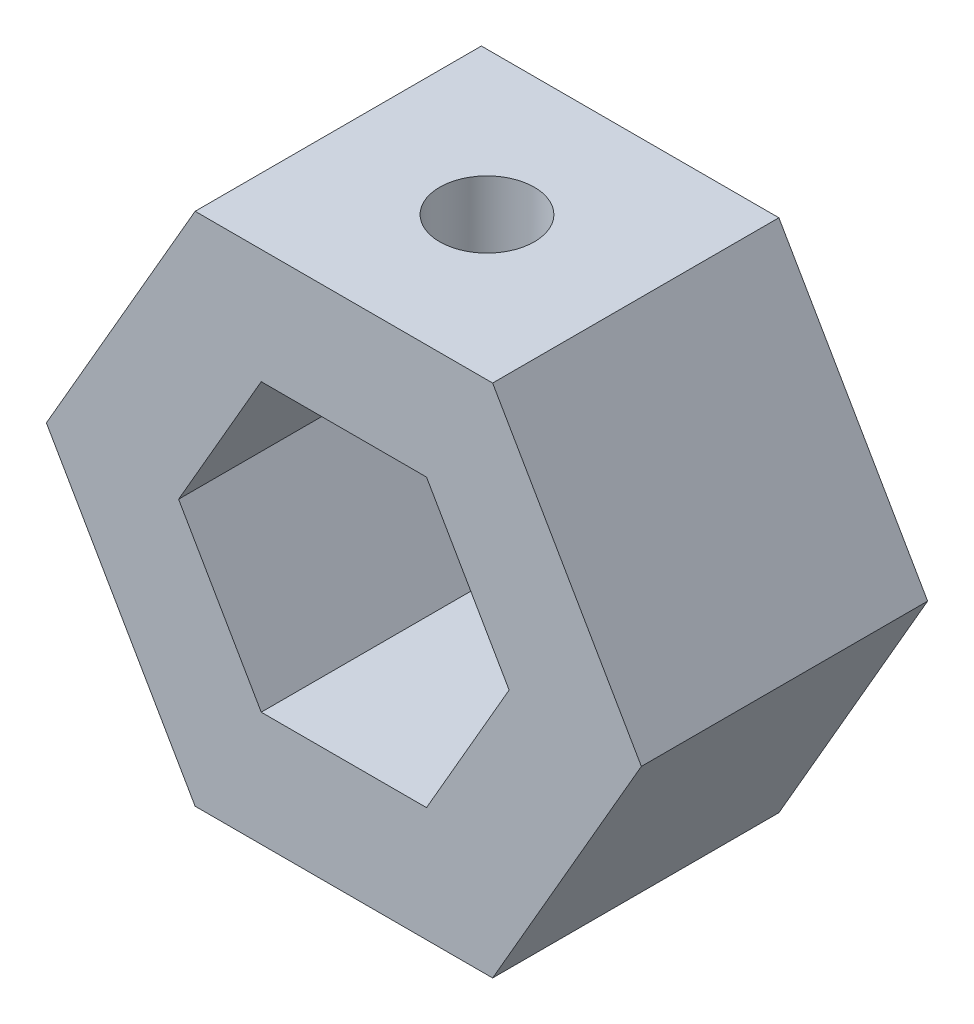
ISO-10303-21;
HEADER;
FILE_DESCRIPTION(('STEP AP214'),'2;1');
FILE_NAME('part.step','',(''),(''),'','','');
FILE_SCHEMA(('AUTOMOTIVE_DESIGN { 1 0 10303 214 1 1 1 1 }'));
ENDSEC;
DATA;
#1=APPLICATION_CONTEXT('core data for automotive mechanical design processes');
#2=APPLICATION_PROTOCOL_DEFINITION('international standard','automotive_design',2000,#1);
#3=PRODUCT_CONTEXT('',#1,'mechanical');
#4=PRODUCT('Part','Part','',(#3));
#5=PRODUCT_RELATED_PRODUCT_CATEGORY('part','',(#4));
#6=PRODUCT_DEFINITION_FORMATION('','',#4);
#7=PRODUCT_DEFINITION_CONTEXT('part definition',#1,'design');
#8=PRODUCT_DEFINITION('design','',#6,#7);
#9=PRODUCT_DEFINITION_SHAPE('','',#8);
#10=(LENGTH_UNIT() NAMED_UNIT(*) SI_UNIT(.MILLI.,.METRE.));
#11=(NAMED_UNIT(*) PLANE_ANGLE_UNIT() SI_UNIT($,.RADIAN.));
#12=(NAMED_UNIT(*) SI_UNIT($,.STERADIAN.) SOLID_ANGLE_UNIT());
#13=UNCERTAINTY_MEASURE_WITH_UNIT(LENGTH_MEASURE(1.E-05),#10,'distance_accuracy_value','');
#14=(GEOMETRIC_REPRESENTATION_CONTEXT(3) GLOBAL_UNCERTAINTY_ASSIGNED_CONTEXT((#13)) GLOBAL_UNIT_ASSIGNED_CONTEXT((#10,
#11,#12)) REPRESENTATION_CONTEXT('',''));
#15=CARTESIAN_POINT('',(0.,0.,0.));
#16=DIRECTION('',(0.,0.,1.));
#17=DIRECTION('',(1.,0.,0.));
#18=AXIS2_PLACEMENT_3D('',#15,#16,#17);
#19=CARTESIAN_POINT('',(9.89867036525614,-5.715,2.54));
#20=DIRECTION('',(-0.866025403784439,0.5,0.));
#21=DIRECTION('',(-0.5,-0.866025403784439,0.));
#22=AXIS2_PLACEMENT_3D('',#19,#20,#21);
#23=PLANE('',#22);
#24=DIRECTION('',(0.5,0.866025403784439,0.));
#25=VECTOR('',#24,1.);
#26=CARTESIAN_POINT('',(9.89867036525614,-5.715,0.));
#27=LINE('',#26,#25);
#28=CARTESIAN_POINT('',(6.59911357683742,-11.43,0.));
#29=VERTEX_POINT('',#28);
#30=CARTESIAN_POINT('',(13.1982271536748,0.,0.));
#31=VERTEX_POINT('',#30);
#32=EDGE_CURVE('E218',#29,#31,#27,.T.);
#33=ORIENTED_EDGE('',*,*,#32,.T.);
#34=DIRECTION('',(0.,0.,-1.));
#35=VECTOR('',#34,1.);
#36=CARTESIAN_POINT('',(13.1982271536748,0.,2.54));
#37=LINE('',#36,#35);
#38=CARTESIAN_POINT('',(13.1982271536748,0.,12.7));
#39=VERTEX_POINT('',#38);
#40=EDGE_CURVE('E11',#39,#31,#37,.T.);
#41=ORIENTED_EDGE('',*,*,#40,.F.);
#42=DIRECTION('',(0.5,0.866025403784439,0.));
#43=VECTOR('',#42,1.);
#44=CARTESIAN_POINT('',(6.59911357683742,-11.43,12.7));
#45=LINE('',#44,#43);
#46=CARTESIAN_POINT('',(6.59911357683742,-11.43,12.7));
#47=VERTEX_POINT('',#46);
#48=EDGE_CURVE('E193',#47,#39,#45,.T.);
#49=ORIENTED_EDGE('',*,*,#48,.F.);
#50=DIRECTION('',(0.,0.,-1.));
#51=VECTOR('',#50,1.);
#52=CARTESIAN_POINT('',(6.59911357683742,-11.43,2.54));
#53=LINE('',#52,#51);
#54=EDGE_CURVE('E231',#47,#29,#53,.T.);
#55=ORIENTED_EDGE('',*,*,#54,.T.);
#56=EDGE_LOOP('',(#33,#41,#49,#55));
#57=FACE_BOUND('',#56,.T.);
#58=ADVANCED_FACE('F47',(#57),#23,.F.);
#59=CARTESIAN_POINT('',(9.89867036525613,5.715,2.54));
#60=DIRECTION('',(-0.866025403784439,-0.5,0.));
#61=DIRECTION('',(0.5,-0.866025403784439,0.));
#62=AXIS2_PLACEMENT_3D('',#59,#60,#61);
#63=PLANE('',#62);
#64=DIRECTION('',(-0.5,0.866025403784439,0.));
#65=VECTOR('',#64,1.);
#66=CARTESIAN_POINT('',(9.89867036525613,5.715,0.));
#67=LINE('',#66,#65);
#68=CARTESIAN_POINT('',(6.59911357683742,11.43,0.));
#69=VERTEX_POINT('',#68);
#70=EDGE_CURVE('E221',#31,#69,#67,.T.);
#71=ORIENTED_EDGE('',*,*,#70,.T.);
#72=DIRECTION('',(0.,0.,-1.));
#73=VECTOR('',#72,1.);
#74=CARTESIAN_POINT('',(6.59911357683742,11.43,2.54));
#75=LINE('',#74,#73);
#76=CARTESIAN_POINT('',(6.59911357683742,11.43,12.7));
#77=VERTEX_POINT('',#76);
#78=EDGE_CURVE('E54',#77,#69,#75,.T.);
#79=ORIENTED_EDGE('',*,*,#78,.F.);
#80=DIRECTION('',(-0.5,0.866025403784439,0.));
#81=VECTOR('',#80,1.);
#82=CARTESIAN_POINT('',(13.1982271536748,0.,12.7));
#83=LINE('',#82,#81);
#84=EDGE_CURVE('E150',#39,#77,#83,.T.);
#85=ORIENTED_EDGE('',*,*,#84,.F.);
#86=ORIENTED_EDGE('',*,*,#40,.T.);
#87=EDGE_LOOP('',(#71,#79,#85,#86));
#88=FACE_BOUND('',#87,.T.);
#89=ADVANCED_FACE('F267',(#88),#63,.F.);
#90=CARTESIAN_POINT('',(0.,11.43,2.54));
#91=DIRECTION('',(0.,-1.,0.));
#92=DIRECTION('',(0.,0.,-1.));
#93=AXIS2_PLACEMENT_3D('',#90,#91,#92);
#94=PLANE('',#93);
#95=CARTESIAN_POINT('',(0.,11.43,6.35));
#96=DIRECTION('',(0.,1.,0.));
#97=DIRECTION('',(0.,0.,1.));
#98=AXIS2_PLACEMENT_3D('',#95,#96,#97);
#99=CIRCLE('',#98,2.1);
#100=CARTESIAN_POINT('',(0.,11.43,8.45));
#101=VERTEX_POINT('',#100);
#102=EDGE_CURVE('E326',#101,#101,#99,.T.);
#103=ORIENTED_EDGE('',*,*,#102,.F.);
#104=EDGE_LOOP('',(#103));
#105=FACE_BOUND('',#104,.T.);
#106=DIRECTION('',(-1.,0.,0.));
#107=VECTOR('',#106,1.);
#108=CARTESIAN_POINT('',(0.,11.43,0.));
#109=LINE('',#108,#107);
#110=CARTESIAN_POINT('',(-6.59911357683742,11.43,0.));
#111=VERTEX_POINT('',#110);
#112=EDGE_CURVE('E223',#69,#111,#109,.T.);
#113=ORIENTED_EDGE('',*,*,#112,.T.);
#114=DIRECTION('',(0.,0.,-1.));
#115=VECTOR('',#114,1.);
#116=CARTESIAN_POINT('',(-6.59911357683742,11.43,2.54));
#117=LINE('',#116,#115);
#118=CARTESIAN_POINT('',(-6.59911357683742,11.43,12.7));
#119=VERTEX_POINT('',#118);
#120=EDGE_CURVE('E240',#119,#111,#117,.T.);
#121=ORIENTED_EDGE('',*,*,#120,.F.);
#122=DIRECTION('',(-1.,0.,0.));
#123=VECTOR('',#122,1.);
#124=CARTESIAN_POINT('',(6.59911357683742,11.43,12.7));
#125=LINE('',#124,#123);
#126=EDGE_CURVE('E181',#77,#119,#125,.T.);
#127=ORIENTED_EDGE('',*,*,#126,.F.);
#128=ORIENTED_EDGE('',*,*,#78,.T.);
#129=EDGE_LOOP('',(#113,#121,#127,#128));
#130=FACE_BOUND('',#129,.T.);
#131=ADVANCED_FACE('F246',(#105,#130),#94,.F.);
#132=CARTESIAN_POINT('',(-9.89867036525613,5.715,2.54));
#133=DIRECTION('',(0.866025403784439,-0.5,0.));
#134=DIRECTION('',(0.5,0.866025403784439,0.));
#135=AXIS2_PLACEMENT_3D('',#132,#133,#134);
#136=PLANE('',#135);
#137=DIRECTION('',(-0.5,-0.866025403784439,0.));
#138=VECTOR('',#137,1.);
#139=CARTESIAN_POINT('',(-9.89867036525613,5.715,0.));
#140=LINE('',#139,#138);
#141=CARTESIAN_POINT('',(-13.1982271536748,0.,0.));
#142=VERTEX_POINT('',#141);
#143=EDGE_CURVE('E225',#111,#142,#140,.T.);
#144=ORIENTED_EDGE('',*,*,#143,.T.);
#145=DIRECTION('',(0.,0.,-1.));
#146=VECTOR('',#145,1.);
#147=CARTESIAN_POINT('',(-13.1982271536748,0.,2.54));
#148=LINE('',#147,#146);
#149=CARTESIAN_POINT('',(-13.1982271536748,0.,12.7));
#150=VERTEX_POINT('',#149);
#151=EDGE_CURVE('E237',#150,#142,#148,.T.);
#152=ORIENTED_EDGE('',*,*,#151,.F.);
#153=DIRECTION('',(-0.5,-0.866025403784439,0.));
#154=VECTOR('',#153,1.);
#155=CARTESIAN_POINT('',(-6.59911357683742,11.43,12.7));
#156=LINE('',#155,#154);
#157=EDGE_CURVE('E184',#119,#150,#156,.T.);
#158=ORIENTED_EDGE('',*,*,#157,.F.);
#159=ORIENTED_EDGE('',*,*,#120,.T.);
#160=EDGE_LOOP('',(#144,#152,#158,#159));
#161=FACE_BOUND('',#160,.T.);
#162=ADVANCED_FACE('F256',(#161),#136,.F.);
#163=CARTESIAN_POINT('',(-9.89867036525613,-5.715,2.54));
#164=DIRECTION('',(0.866025403784439,0.5,0.));
#165=DIRECTION('',(-0.5,0.866025403784439,0.));
#166=AXIS2_PLACEMENT_3D('',#163,#164,#165);
#167=PLANE('',#166);
#168=DIRECTION('',(0.5,-0.866025403784439,0.));
#169=VECTOR('',#168,1.);
#170=CARTESIAN_POINT('',(-9.89867036525613,-5.715,0.));
#171=LINE('',#170,#169);
#172=CARTESIAN_POINT('',(-6.59911357683742,-11.43,0.));
#173=VERTEX_POINT('',#172);
#174=EDGE_CURVE('E227',#142,#173,#171,.T.);
#175=ORIENTED_EDGE('',*,*,#174,.T.);
#176=DIRECTION('',(0.,0.,-1.));
#177=VECTOR('',#176,1.);
#178=CARTESIAN_POINT('',(-6.59911357683742,-11.43,2.54));
#179=LINE('',#178,#177);
#180=CARTESIAN_POINT('',(-6.59911357683742,-11.43,12.7));
#181=VERTEX_POINT('',#180);
#182=EDGE_CURVE('E234',#181,#173,#179,.T.);
#183=ORIENTED_EDGE('',*,*,#182,.F.);
#184=DIRECTION('',(0.5,-0.866025403784439,0.));
#185=VECTOR('',#184,1.);
#186=CARTESIAN_POINT('',(-13.1982271536748,0.,12.7));
#187=LINE('',#186,#185);
#188=EDGE_CURVE('E187',#150,#181,#187,.T.);
#189=ORIENTED_EDGE('',*,*,#188,.F.);
#190=ORIENTED_EDGE('',*,*,#151,.T.);
#191=EDGE_LOOP('',(#175,#183,#189,#190));
#192=FACE_BOUND('',#191,.T.);
#193=ADVANCED_FACE('F260',(#192),#167,.F.);
#194=CARTESIAN_POINT('',(0.,-11.43,2.54));
#195=DIRECTION('',(0.,1.,0.));
#196=DIRECTION('',(0.,0.,1.));
#197=AXIS2_PLACEMENT_3D('',#194,#195,#196);
#198=PLANE('',#197);
#199=DIRECTION('',(1.,0.,0.));
#200=VECTOR('',#199,1.);
#201=CARTESIAN_POINT('',(0.,-11.43,0.));
#202=LINE('',#201,#200);
#203=EDGE_CURVE('E229',#173,#29,#202,.T.);
#204=ORIENTED_EDGE('',*,*,#203,.T.);
#205=ORIENTED_EDGE('',*,*,#54,.F.);
#206=DIRECTION('',(1.,0.,0.));
#207=VECTOR('',#206,1.);
#208=CARTESIAN_POINT('',(-6.59911357683742,-11.43,12.7));
#209=LINE('',#208,#207);
#210=EDGE_CURVE('E190',#181,#47,#209,.T.);
#211=ORIENTED_EDGE('',*,*,#210,.F.);
#212=ORIENTED_EDGE('',*,*,#182,.T.);
#213=EDGE_LOOP('',(#204,#205,#211,#212));
#214=FACE_BOUND('',#213,.T.);
#215=ADVANCED_FACE('F265',(#214),#198,.F.);
#216=CARTESIAN_POINT('',(0.,0.,2.54));
#217=DIRECTION('',(0.,0.,1.));
#218=DIRECTION('',(1.,0.,0.));
#219=AXIS2_PLACEMENT_3D('',#216,#217,#218);
#220=PLANE('',#219);
#221=DIRECTION('',(-1.,0.,0.));
#222=VECTOR('',#221,1.);
#223=CARTESIAN_POINT('',(0.,-6.35,2.54));
#224=LINE('',#223,#222);
#225=CARTESIAN_POINT('',(3.66617420935413,-6.35,2.54));
#226=VERTEX_POINT('',#225);
#227=CARTESIAN_POINT('',(-3.66617420935412,-6.35,2.54));
#228=VERTEX_POINT('',#227);
#229=EDGE_CURVE('E61',#226,#228,#224,.T.);
#230=ORIENTED_EDGE('',*,*,#229,.F.);
#231=DIRECTION('',(-0.5,-0.866025403784439,0.));
#232=VECTOR('',#231,1.);
#233=CARTESIAN_POINT('',(5.49926131403119,-3.175,2.54));
#234=LINE('',#233,#232);
#235=CARTESIAN_POINT('',(7.33234841870825,0.,2.54));
#236=VERTEX_POINT('',#235);
#237=EDGE_CURVE('E65',#236,#226,#234,.T.);
#238=ORIENTED_EDGE('',*,*,#237,.F.);
#239=DIRECTION('',(0.5,-0.866025403784439,0.));
#240=VECTOR('',#239,1.);
#241=CARTESIAN_POINT('',(5.49926131403119,3.175,2.54));
#242=LINE('',#241,#240);
#243=CARTESIAN_POINT('',(3.66617420935412,6.35,2.54));
#244=VERTEX_POINT('',#243);
#245=EDGE_CURVE('E205',#244,#236,#242,.T.);
#246=ORIENTED_EDGE('',*,*,#245,.F.);
#247=DIRECTION('',(1.,0.,0.));
#248=VECTOR('',#247,1.);
#249=CARTESIAN_POINT('',(0.,6.35,2.54));
#250=LINE('',#249,#248);
#251=CARTESIAN_POINT('',(-3.66617420935412,6.35,2.54));
#252=VERTEX_POINT('',#251);
#253=EDGE_CURVE('E202',#252,#244,#250,.T.);
#254=ORIENTED_EDGE('',*,*,#253,.F.);
#255=DIRECTION('',(0.5,0.866025403784439,0.));
#256=VECTOR('',#255,1.);
#257=CARTESIAN_POINT('',(-5.49926131403118,3.175,2.54));
#258=LINE('',#257,#256);
#259=CARTESIAN_POINT('',(-7.33234841870825,0.,2.54));
#260=VERTEX_POINT('',#259);
#261=EDGE_CURVE('E199',#260,#252,#258,.T.);
#262=ORIENTED_EDGE('',*,*,#261,.F.);
#263=DIRECTION('',(-0.5,0.866025403784439,0.));
#264=VECTOR('',#263,1.);
#265=CARTESIAN_POINT('',(-5.49926131403119,-3.175,2.54));
#266=LINE('',#265,#264);
#267=EDGE_CURVE('E196',#228,#260,#266,.T.);
#268=ORIENTED_EDGE('',*,*,#267,.F.);
#269=EDGE_LOOP('',(#230,#238,#246,#254,#262,#268));
#270=FACE_BOUND('',#269,.T.);
#271=CARTESIAN_POINT('',(0.,0.,2.54));
#272=DIRECTION('',(0.,0.,1.));
#273=DIRECTION('',(1.,0.,0.));
#274=AXIS2_PLACEMENT_3D('',#271,#272,#273);
#275=CIRCLE('',#274,3.15);
#276=CARTESIAN_POINT('',(3.15,0.,2.54));
#277=VERTEX_POINT('',#276);
#278=EDGE_CURVE('E209',#277,#277,#275,.T.);
#279=ORIENTED_EDGE('',*,*,#278,.F.);
#280=EDGE_LOOP('',(#279));
#281=FACE_BOUND('',#280,.T.);
#282=ADVANCED_FACE('F282',(#270,#281),#220,.T.);
#283=CARTESIAN_POINT('',(0.,0.,0.));
#284=DIRECTION('',(0.,0.,1.));
#285=DIRECTION('',(1.,0.,0.));
#286=AXIS2_PLACEMENT_3D('',#283,#284,#285);
#287=PLANE('',#286);
#288=CARTESIAN_POINT('',(0.,0.,0.));
#289=DIRECTION('',(0.,0.,1.));
#290=DIRECTION('',(1.,0.,0.));
#291=AXIS2_PLACEMENT_3D('',#288,#289,#290);
#292=CIRCLE('',#291,1.7);
#293=CARTESIAN_POINT('',(1.7,0.,0.));
#294=VERTEX_POINT('',#293);
#295=EDGE_CURVE('E215',#294,#294,#292,.T.);
#296=ORIENTED_EDGE('',*,*,#295,.T.);
#297=EDGE_LOOP('',(#296));
#298=FACE_BOUND('',#297,.T.);
#299=ORIENTED_EDGE('',*,*,#32,.F.);
#300=ORIENTED_EDGE('',*,*,#203,.F.);
#301=ORIENTED_EDGE('',*,*,#174,.F.);
#302=ORIENTED_EDGE('',*,*,#143,.F.);
#303=ORIENTED_EDGE('',*,*,#112,.F.);
#304=ORIENTED_EDGE('',*,*,#70,.F.);
#305=EDGE_LOOP('',(#299,#300,#301,#302,#303,#304));
#306=FACE_BOUND('',#305,.T.);
#307=ADVANCED_FACE('F252',(#298,#306),#287,.F.);
#308=CARTESIAN_POINT('',(0.,0.,2.54));
#309=DIRECTION('',(0.,0.,1.));
#310=DIRECTION('',(1.,0.,0.));
#311=AXIS2_PLACEMENT_3D('',#308,#309,#310);
#312=CYLINDRICAL_SURFACE('',#311,1.7);
#313=ORIENTED_EDGE('',*,*,#295,.F.);
#314=EDGE_LOOP('',(#313));
#315=FACE_BOUND('',#314,.T.);
#316=CARTESIAN_POINT('',(0.,0.,1.09));
#317=DIRECTION('',(0.,0.,1.));
#318=DIRECTION('',(1.,0.,0.));
#319=AXIS2_PLACEMENT_3D('',#316,#317,#318);
#320=CIRCLE('',#319,1.7);
#321=CARTESIAN_POINT('',(1.7,0.,1.09));
#322=VERTEX_POINT('',#321);
#323=EDGE_CURVE('E212',#322,#322,#320,.T.);
#324=ORIENTED_EDGE('',*,*,#323,.T.);
#325=EDGE_LOOP('',(#324));
#326=FACE_BOUND('',#325,.T.);
#327=ADVANCED_FACE('F285',(#315,#326),#312,.F.);
#328=CARTESIAN_POINT('',(0.,0.,2.54));
#329=DIRECTION('',(0.,0.,1.));
#330=DIRECTION('',(1.,0.,0.));
#331=AXIS2_PLACEMENT_3D('',#328,#329,#330);
#332=CONICAL_SURFACE('',#331,3.15,0.785398163397448);
#333=ORIENTED_EDGE('',*,*,#323,.F.);
#334=EDGE_LOOP('',(#333));
#335=FACE_BOUND('',#334,.T.);
#336=ORIENTED_EDGE('',*,*,#278,.T.);
#337=EDGE_LOOP('',(#336));
#338=FACE_BOUND('',#337,.T.);
#339=ADVANCED_FACE('F291',(#335,#338),#332,.F.);
#340=CARTESIAN_POINT('',(0.,0.,12.7));
#341=DIRECTION('',(0.,0.,1.));
#342=DIRECTION('',(1.,0.,0.));
#343=AXIS2_PLACEMENT_3D('',#340,#341,#342);
#344=PLANE('',#343);
#345=ORIENTED_EDGE('',*,*,#84,.T.);
#346=ORIENTED_EDGE('',*,*,#126,.T.);
#347=ORIENTED_EDGE('',*,*,#157,.T.);
#348=ORIENTED_EDGE('',*,*,#188,.T.);
#349=ORIENTED_EDGE('',*,*,#210,.T.);
#350=ORIENTED_EDGE('',*,*,#48,.T.);
#351=EDGE_LOOP('',(#345,#346,#347,#348,#349,#350));
#352=FACE_BOUND('',#351,.T.);
#353=DIRECTION('',(0.5,0.866025403784439,0.));
#354=VECTOR('',#353,1.);
#355=CARTESIAN_POINT('',(3.66617420935413,-6.35,12.7));
#356=LINE('',#355,#354);
#357=CARTESIAN_POINT('',(3.66617420935413,-6.35,12.7));
#358=VERTEX_POINT('',#357);
#359=CARTESIAN_POINT('',(7.33234841870825,0.,12.7));
#360=VERTEX_POINT('',#359);
#361=EDGE_CURVE('E143',#358,#360,#356,.T.);
#362=ORIENTED_EDGE('',*,*,#361,.F.);
#363=DIRECTION('',(1.,0.,0.));
#364=VECTOR('',#363,1.);
#365=CARTESIAN_POINT('',(-3.66617420935412,-6.35,12.7));
#366=LINE('',#365,#364);
#367=CARTESIAN_POINT('',(-3.66617420935412,-6.35,12.7));
#368=VERTEX_POINT('',#367);
#369=EDGE_CURVE('E134',#368,#358,#366,.T.);
#370=ORIENTED_EDGE('',*,*,#369,.F.);
#371=DIRECTION('',(0.5,-0.866025403784439,0.));
#372=VECTOR('',#371,1.);
#373=CARTESIAN_POINT('',(-7.33234841870825,0.,12.7));
#374=LINE('',#373,#372);
#375=CARTESIAN_POINT('',(-7.33234841870825,0.,12.7));
#376=VERTEX_POINT('',#375);
#377=EDGE_CURVE('E166',#376,#368,#374,.T.);
#378=ORIENTED_EDGE('',*,*,#377,.F.);
#379=DIRECTION('',(-0.5,-0.866025403784439,0.));
#380=VECTOR('',#379,1.);
#381=CARTESIAN_POINT('',(-3.66617420935412,6.35,12.7));
#382=LINE('',#381,#380);
#383=CARTESIAN_POINT('',(-3.66617420935412,6.35,12.7));
#384=VERTEX_POINT('',#383);
#385=EDGE_CURVE('E163',#384,#376,#382,.T.);
#386=ORIENTED_EDGE('',*,*,#385,.F.);
#387=DIRECTION('',(-1.,0.,0.));
#388=VECTOR('',#387,1.);
#389=CARTESIAN_POINT('',(3.66617420935412,6.35,12.7));
#390=LINE('',#389,#388);
#391=CARTESIAN_POINT('',(3.66617420935412,6.35,12.7));
#392=VERTEX_POINT('',#391);
#393=EDGE_CURVE('E158',#392,#384,#390,.T.);
#394=ORIENTED_EDGE('',*,*,#393,.F.);
#395=DIRECTION('',(-0.5,0.866025403784439,0.));
#396=VECTOR('',#395,1.);
#397=CARTESIAN_POINT('',(7.33234841870825,0.,12.7));
#398=LINE('',#397,#396);
#399=EDGE_CURVE('E156',#360,#392,#398,.T.);
#400=ORIENTED_EDGE('',*,*,#399,.F.);
#401=EDGE_LOOP('',(#362,#370,#378,#386,#394,#400));
#402=FACE_BOUND('',#401,.T.);
#403=ADVANCED_FACE('F154',(#352,#402),#344,.T.);
#404=CARTESIAN_POINT('',(-3.66617420935412,-6.35,12.7));
#405=DIRECTION('',(0.,1.,0.));
#406=DIRECTION('',(-1.,0.,0.));
#407=AXIS2_PLACEMENT_3D('',#404,#405,#406);
#408=PLANE('',#407);
#409=DIRECTION('',(0.,0.,-1.));
#410=VECTOR('',#409,1.);
#411=CARTESIAN_POINT('',(3.66617420935413,-6.35,12.7));
#412=LINE('',#411,#410);
#413=EDGE_CURVE('E137',#358,#226,#412,.T.);
#414=ORIENTED_EDGE('',*,*,#413,.T.);
#415=ORIENTED_EDGE('',*,*,#229,.T.);
#416=DIRECTION('',(0.,0.,-1.));
#417=VECTOR('',#416,1.);
#418=CARTESIAN_POINT('',(-3.66617420935412,-6.35,12.7));
#419=LINE('',#418,#417);
#420=EDGE_CURVE('E139',#368,#228,#419,.T.);
#421=ORIENTED_EDGE('',*,*,#420,.F.);
#422=ORIENTED_EDGE('',*,*,#369,.T.);
#423=EDGE_LOOP('',(#414,#415,#421,#422));
#424=FACE_BOUND('',#423,.T.);
#425=ADVANCED_FACE('F136',(#424),#408,.T.);
#426=CARTESIAN_POINT('',(3.66617420935413,-6.35,12.7));
#427=DIRECTION('',(-0.866025403784439,0.5,0.));
#428=DIRECTION('',(-0.5,-0.866025403784439,0.));
#429=AXIS2_PLACEMENT_3D('',#426,#427,#428);
#430=PLANE('',#429);
#431=DIRECTION('',(0.,0.,-1.));
#432=VECTOR('',#431,1.);
#433=CARTESIAN_POINT('',(7.33234841870825,0.,12.7));
#434=LINE('',#433,#432);
#435=EDGE_CURVE('E151',#360,#236,#434,.T.);
#436=ORIENTED_EDGE('',*,*,#435,.T.);
#437=ORIENTED_EDGE('',*,*,#237,.T.);
#438=ORIENTED_EDGE('',*,*,#413,.F.);
#439=ORIENTED_EDGE('',*,*,#361,.T.);
#440=EDGE_LOOP('',(#436,#437,#438,#439));
#441=FACE_BOUND('',#440,.T.);
#442=ADVANCED_FACE('F148',(#441),#430,.T.);
#443=CARTESIAN_POINT('',(7.33234841870825,0.,12.7));
#444=DIRECTION('',(-0.866025403784439,-0.5,0.));
#445=DIRECTION('',(0.5,-0.866025403784439,0.));
#446=AXIS2_PLACEMENT_3D('',#443,#444,#445);
#447=PLANE('',#446);
#448=DIRECTION('',(0.,0.,-1.));
#449=VECTOR('',#448,1.);
#450=CARTESIAN_POINT('',(3.66617420935412,6.35,12.7));
#451=LINE('',#450,#449);
#452=EDGE_CURVE('E175',#392,#244,#451,.T.);
#453=ORIENTED_EDGE('',*,*,#452,.T.);
#454=ORIENTED_EDGE('',*,*,#245,.T.);
#455=ORIENTED_EDGE('',*,*,#435,.F.);
#456=ORIENTED_EDGE('',*,*,#399,.T.);
#457=EDGE_LOOP('',(#453,#454,#455,#456));
#458=FACE_BOUND('',#457,.T.);
#459=ADVANCED_FACE('F302',(#458),#447,.T.);
#460=CARTESIAN_POINT('',(3.66617420935412,6.35,12.7));
#461=DIRECTION('',(0.,-1.,0.));
#462=DIRECTION('',(0.,0.,-1.));
#463=AXIS2_PLACEMENT_3D('',#460,#461,#462);
#464=PLANE('',#463);
#465=CARTESIAN_POINT('',(0.,6.35,6.35));
#466=DIRECTION('',(0.,-1.,0.));
#467=DIRECTION('',(0.,0.,-1.));
#468=AXIS2_PLACEMENT_3D('',#465,#466,#467);
#469=CIRCLE('',#468,2.1);
#470=CARTESIAN_POINT('',(0.,6.35,4.25));
#471=VERTEX_POINT('',#470);
#472=EDGE_CURVE('E144',#471,#471,#469,.T.);
#473=ORIENTED_EDGE('',*,*,#472,.F.);
#474=EDGE_LOOP('',(#473));
#475=FACE_BOUND('',#474,.T.);
#476=DIRECTION('',(0.,0.,-1.));
#477=VECTOR('',#476,1.);
#478=CARTESIAN_POINT('',(-3.66617420935412,6.35,12.7));
#479=LINE('',#478,#477);
#480=EDGE_CURVE('E172',#384,#252,#479,.T.);
#481=ORIENTED_EDGE('',*,*,#480,.T.);
#482=ORIENTED_EDGE('',*,*,#253,.T.);
#483=ORIENTED_EDGE('',*,*,#452,.F.);
#484=ORIENTED_EDGE('',*,*,#393,.T.);
#485=EDGE_LOOP('',(#481,#482,#483,#484));
#486=FACE_BOUND('',#485,.T.);
#487=ADVANCED_FACE('F305',(#475,#486),#464,.T.);
#488=CARTESIAN_POINT('',(-3.66617420935412,6.35,12.7));
#489=DIRECTION('',(0.866025403784439,-0.5,0.));
#490=DIRECTION('',(0.5,0.866025403784439,0.));
#491=AXIS2_PLACEMENT_3D('',#488,#489,#490);
#492=PLANE('',#491);
#493=DIRECTION('',(0.,0.,-1.));
#494=VECTOR('',#493,1.);
#495=CARTESIAN_POINT('',(-7.33234841870825,0.,12.7));
#496=LINE('',#495,#494);
#497=EDGE_CURVE('E169',#376,#260,#496,.T.);
#498=ORIENTED_EDGE('',*,*,#497,.T.);
#499=ORIENTED_EDGE('',*,*,#261,.T.);
#500=ORIENTED_EDGE('',*,*,#480,.F.);
#501=ORIENTED_EDGE('',*,*,#385,.T.);
#502=EDGE_LOOP('',(#498,#499,#500,#501));
#503=FACE_BOUND('',#502,.T.);
#504=ADVANCED_FACE('F309',(#503),#492,.T.);
#505=CARTESIAN_POINT('',(-7.33234841870825,0.,12.7));
#506=DIRECTION('',(0.866025403784439,0.5,0.));
#507=DIRECTION('',(-0.5,0.866025403784439,0.));
#508=AXIS2_PLACEMENT_3D('',#505,#506,#507);
#509=PLANE('',#508);
#510=ORIENTED_EDGE('',*,*,#420,.T.);
#511=ORIENTED_EDGE('',*,*,#267,.T.);
#512=ORIENTED_EDGE('',*,*,#497,.F.);
#513=ORIENTED_EDGE('',*,*,#377,.T.);
#514=EDGE_LOOP('',(#510,#511,#512,#513));
#515=FACE_BOUND('',#514,.T.);
#516=ADVANCED_FACE('F313',(#515),#509,.T.);
#517=CARTESIAN_POINT('',(0.,11.43,6.35));
#518=DIRECTION('',(0.,1.,0.));
#519=DIRECTION('',(0.,0.,1.));
#520=AXIS2_PLACEMENT_3D('',#517,#518,#519);
#521=CYLINDRICAL_SURFACE('',#520,2.1);
#522=ORIENTED_EDGE('',*,*,#102,.T.);
#523=EDGE_LOOP('',(#522));
#524=FACE_BOUND('',#523,.T.);
#525=ORIENTED_EDGE('',*,*,#472,.T.);
#526=EDGE_LOOP('',(#525));
#527=FACE_BOUND('',#526,.T.);
#528=ADVANCED_FACE('F317',(#524,#527),#521,.F.);
#529=CLOSED_SHELL('',(#58,#89,#131,#162,#193,#215,#282,#307,#327,#339,#403,#425,#442,#459,#487,
#504,#516,#528));
#530=MANIFOLD_SOLID_BREP('B2',#529);
#531=ADVANCED_BREP_SHAPE_REPRESENTATION('',(#18,#530),#14);
#532=SHAPE_DEFINITION_REPRESENTATION(#9,#531);
ENDSEC;
END-ISO-10303-21;
